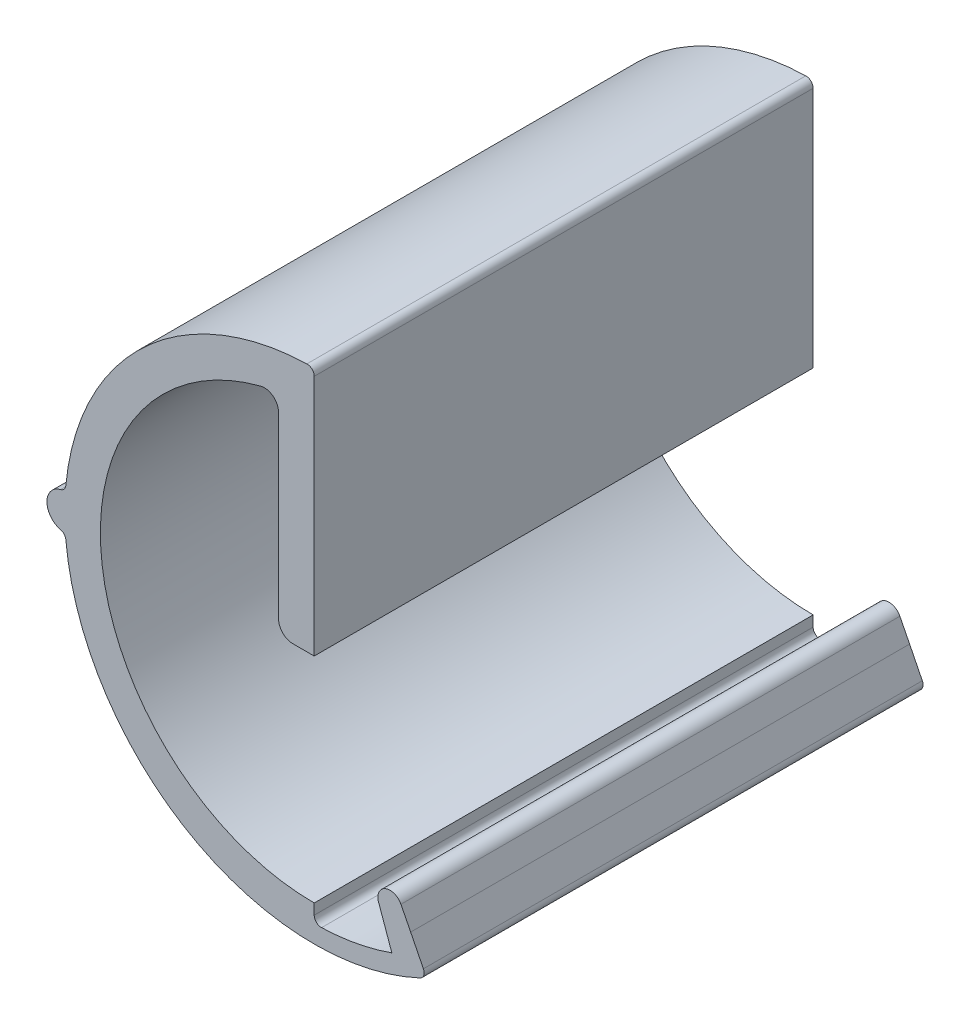
ISO-10303-21;
HEADER;
FILE_DESCRIPTION(('STEP AP214'),'2;1');
FILE_NAME('part.step','',(''),(''),'','','');
FILE_SCHEMA(('AUTOMOTIVE_DESIGN { 1 0 10303 214 1 1 1 1 }'));
ENDSEC;
DATA;
#1=APPLICATION_CONTEXT('core data for automotive mechanical design processes');
#2=APPLICATION_PROTOCOL_DEFINITION('international standard','automotive_design',2000,#1);
#3=PRODUCT_CONTEXT('',#1,'mechanical');
#4=PRODUCT('Part','Part','',(#3));
#5=PRODUCT_RELATED_PRODUCT_CATEGORY('part','',(#4));
#6=PRODUCT_DEFINITION_FORMATION('','',#4);
#7=PRODUCT_DEFINITION_CONTEXT('part definition',#1,'design');
#8=PRODUCT_DEFINITION('design','',#6,#7);
#9=PRODUCT_DEFINITION_SHAPE('','',#8);
#10=(LENGTH_UNIT() NAMED_UNIT(*) SI_UNIT(.MILLI.,.METRE.));
#11=(NAMED_UNIT(*) PLANE_ANGLE_UNIT() SI_UNIT($,.RADIAN.));
#12=(NAMED_UNIT(*) SI_UNIT($,.STERADIAN.) SOLID_ANGLE_UNIT());
#13=UNCERTAINTY_MEASURE_WITH_UNIT(LENGTH_MEASURE(1.E-05),#10,'distance_accuracy_value','');
#14=(GEOMETRIC_REPRESENTATION_CONTEXT(3) GLOBAL_UNCERTAINTY_ASSIGNED_CONTEXT((#13)) GLOBAL_UNIT_ASSIGNED_CONTEXT((#10,
#11,#12)) REPRESENTATION_CONTEXT('',''));
#15=CARTESIAN_POINT('',(0.,0.,0.));
#16=DIRECTION('',(0.,0.,1.));
#17=DIRECTION('',(1.,0.,0.));
#18=AXIS2_PLACEMENT_3D('',#15,#16,#17);
#19=CARTESIAN_POINT('',(0.,0.,-70.));
#20=DIRECTION('',(0.,-1.,0.));
#21=DIRECTION('',(1.,0.,0.));
#22=AXIS2_PLACEMENT_3D('',#19,#20,#21);
#23=PLANE('',#22);
#24=DIRECTION('',(1.,0.,0.));
#25=VECTOR('',#24,1.);
#26=CARTESIAN_POINT('',(0.,0.,0.));
#27=LINE('',#26,#25);
#28=CARTESIAN_POINT('',(-3.,0.,0.));
#29=VERTEX_POINT('',#28);
#30=CARTESIAN_POINT('',(0.,0.,0.));
#31=VERTEX_POINT('',#30);
#32=EDGE_CURVE('E262',#29,#31,#27,.T.);
#33=ORIENTED_EDGE('',*,*,#32,.F.);
#34=DIRECTION('',(0.,0.,1.));
#35=VECTOR('',#34,1.);
#36=CARTESIAN_POINT('',(-3.,0.,-70.));
#37=LINE('',#36,#35);
#38=CARTESIAN_POINT('',(-3.,0.,-70.));
#39=VERTEX_POINT('',#38);
#40=EDGE_CURVE('E198',#29,#39,#37,.F.);
#41=ORIENTED_EDGE('',*,*,#40,.T.);
#42=DIRECTION('',(1.,0.,0.));
#43=VECTOR('',#42,1.);
#44=CARTESIAN_POINT('',(0.,0.,-70.));
#45=LINE('',#44,#43);
#46=CARTESIAN_POINT('',(0.,0.,-70.));
#47=VERTEX_POINT('',#46);
#48=EDGE_CURVE('E192',#39,#47,#45,.T.);
#49=ORIENTED_EDGE('',*,*,#48,.T.);
#50=DIRECTION('',(0.,0.,1.));
#51=VECTOR('',#50,1.);
#52=CARTESIAN_POINT('',(0.,0.,-70.));
#53=LINE('',#52,#51);
#54=EDGE_CURVE('E195',#47,#31,#53,.T.);
#55=ORIENTED_EDGE('',*,*,#54,.T.);
#56=EDGE_LOOP('',(#33,#41,#49,#55));
#57=FACE_BOUND('',#56,.T.);
#58=ADVANCED_FACE('F56',(#57),#23,.T.);
#59=CARTESIAN_POINT('',(-5.,0.,-70.));
#60=DIRECTION('',(-1.,0.,0.));
#61=DIRECTION('',(0.,0.,1.));
#62=AXIS2_PLACEMENT_3D('',#59,#60,#61);
#63=PLANE('',#62);
#64=DIRECTION('',(0.,-1.,0.));
#65=VECTOR('',#64,1.);
#66=CARTESIAN_POINT('',(-5.,0.,0.));
#67=LINE('',#66,#65);
#68=CARTESIAN_POINT('',(-5.,27.1108834234519,0.));
#69=VERTEX_POINT('',#68);
#70=CARTESIAN_POINT('',(-5.,2.,0.));
#71=VERTEX_POINT('',#70);
#72=EDGE_CURVE('E205',#69,#71,#67,.T.);
#73=ORIENTED_EDGE('',*,*,#72,.F.);
#74=DIRECTION('',(0.,0.,-1.));
#75=VECTOR('',#74,1.);
#76=CARTESIAN_POINT('',(-5.,27.1108834234519,-70.));
#77=LINE('',#76,#75);
#78=CARTESIAN_POINT('',(-5.,27.1108834234519,-70.));
#79=VERTEX_POINT('',#78);
#80=EDGE_CURVE('E337',#69,#79,#77,.T.);
#81=ORIENTED_EDGE('',*,*,#80,.T.);
#82=DIRECTION('',(0.,-1.,0.));
#83=VECTOR('',#82,1.);
#84=CARTESIAN_POINT('',(-5.,0.,-70.));
#85=LINE('',#84,#83);
#86=CARTESIAN_POINT('',(-5.,2.,-70.));
#87=VERTEX_POINT('',#86);
#88=EDGE_CURVE('E215',#79,#87,#85,.T.);
#89=ORIENTED_EDGE('',*,*,#88,.T.);
#90=DIRECTION('',(0.,0.,1.));
#91=VECTOR('',#90,1.);
#92=CARTESIAN_POINT('',(-5.,2.,-70.));
#93=LINE('',#92,#91);
#94=EDGE_CURVE('E309',#87,#71,#93,.T.);
#95=ORIENTED_EDGE('',*,*,#94,.T.);
#96=EDGE_LOOP('',(#73,#81,#89,#95));
#97=FACE_BOUND('',#96,.T.);
#98=ADVANCED_FACE('F601',(#97),#63,.T.);
#99=CARTESIAN_POINT('',(0.,0.,-70.));
#100=DIRECTION('',(0.,0.,1.));
#101=DIRECTION('',(1.,0.,0.));
#102=AXIS2_PLACEMENT_3D('',#99,#100,#101);
#103=CYLINDRICAL_SURFACE('',#102,30.);
#104=CARTESIAN_POINT('',(0.,0.,-70.));
#105=DIRECTION('',(0.,0.,-1.));
#106=DIRECTION('',(1.,0.,0.));
#107=AXIS2_PLACEMENT_3D('',#104,#105,#106);
#108=CIRCLE('',#107,30.);
#109=CARTESIAN_POINT('',(0.,-30.,-70.));
#110=VERTEX_POINT('',#109);
#111=CARTESIAN_POINT('',(-7.5,29.0473750965556,-70.));
#112=VERTEX_POINT('',#111);
#113=EDGE_CURVE('E256',#110,#112,#108,.T.);
#114=ORIENTED_EDGE('',*,*,#113,.T.);
#115=DIRECTION('',(0.,0.,1.));
#116=VECTOR('',#115,1.);
#117=CARTESIAN_POINT('',(-7.5,29.0473750965556,-70.));
#118=LINE('',#117,#116);
#119=CARTESIAN_POINT('',(-7.5,29.0473750965556,0.));
#120=VERTEX_POINT('',#119);
#121=EDGE_CURVE('E333',#112,#120,#118,.T.);
#122=ORIENTED_EDGE('',*,*,#121,.T.);
#123=CARTESIAN_POINT('',(0.,0.,0.));
#124=DIRECTION('',(0.,0.,-1.));
#125=DIRECTION('',(1.,0.,0.));
#126=AXIS2_PLACEMENT_3D('',#123,#124,#125);
#127=CIRCLE('',#126,30.);
#128=CARTESIAN_POINT('',(0.,-30.,0.));
#129=VERTEX_POINT('',#128);
#130=EDGE_CURVE('E299',#129,#120,#127,.T.);
#131=ORIENTED_EDGE('',*,*,#130,.F.);
#132=DIRECTION('',(0.,0.,1.));
#133=VECTOR('',#132,1.);
#134=CARTESIAN_POINT('',(0.,-30.,-70.));
#135=LINE('',#134,#133);
#136=EDGE_CURVE('E305',#110,#129,#135,.T.);
#137=ORIENTED_EDGE('',*,*,#136,.F.);
#138=EDGE_LOOP('',(#114,#122,#131,#137));
#139=FACE_BOUND('',#138,.T.);
#140=ADVANCED_FACE('F539',(#139),#103,.F.);
#141=CARTESIAN_POINT('',(0.,-30.,-70.));
#142=DIRECTION('',(1.,0.,0.));
#143=DIRECTION('',(0.,0.,-1.));
#144=AXIS2_PLACEMENT_3D('',#141,#142,#143);
#145=PLANE('',#144);
#146=DIRECTION('',(0.,1.,0.));
#147=VECTOR('',#146,1.);
#148=CARTESIAN_POINT('',(0.,-30.,0.));
#149=LINE('',#148,#147);
#150=CARTESIAN_POINT('',(0.,-31.4841229828623,0.));
#151=VERTEX_POINT('',#150);
#152=EDGE_CURVE('E296',#151,#129,#149,.T.);
#153=ORIENTED_EDGE('',*,*,#152,.F.);
#154=DIRECTION('',(0.,0.,-1.));
#155=VECTOR('',#154,1.);
#156=CARTESIAN_POINT('',(0.,-31.4841229828623,-70.));
#157=LINE('',#156,#155);
#158=CARTESIAN_POINT('',(0.,-31.4841229828623,-70.));
#159=VERTEX_POINT('',#158);
#160=EDGE_CURVE('E350',#151,#159,#157,.T.);
#161=ORIENTED_EDGE('',*,*,#160,.T.);
#162=DIRECTION('',(0.,1.,0.));
#163=VECTOR('',#162,1.);
#164=CARTESIAN_POINT('',(0.,-30.,-70.));
#165=LINE('',#164,#163);
#166=EDGE_CURVE('E253',#159,#110,#165,.T.);
#167=ORIENTED_EDGE('',*,*,#166,.T.);
#168=ORIENTED_EDGE('',*,*,#136,.T.);
#169=EDGE_LOOP('',(#153,#161,#167,#168));
#170=FACE_BOUND('',#169,.T.);
#171=ADVANCED_FACE('F545',(#170),#145,.T.);
#172=CARTESIAN_POINT('',(0.,0.,-70.));
#173=DIRECTION('',(0.,0.,1.));
#174=DIRECTION('',(1.,0.,0.));
#175=AXIS2_PLACEMENT_3D('',#172,#173,#174);
#176=CYLINDRICAL_SURFACE('',#175,32.5);
#177=CARTESIAN_POINT('',(0.,0.,-70.));
#178=DIRECTION('',(0.,0.,-1.));
#179=DIRECTION('',(1.,0.,0.));
#180=AXIS2_PLACEMENT_3D('',#177,#178,#179);
#181=CIRCLE('',#180,32.5);
#182=CARTESIAN_POINT('',(10.8933890075338,-30.6199947082057,-70.));
#183=VERTEX_POINT('',#182);
#184=CARTESIAN_POINT('',(1.03174603174603,-32.4836189505722,-70.));
#185=VERTEX_POINT('',#184);
#186=EDGE_CURVE('E249',#183,#185,#181,.T.);
#187=ORIENTED_EDGE('',*,*,#186,.T.);
#188=DIRECTION('',(0.,0.,1.));
#189=VECTOR('',#188,1.);
#190=CARTESIAN_POINT('',(1.03174603174603,-32.4836189505723,-70.));
#191=LINE('',#190,#189);
#192=CARTESIAN_POINT('',(1.03174603174603,-32.4836189505722,0.));
#193=VERTEX_POINT('',#192);
#194=EDGE_CURVE('E346',#185,#193,#191,.T.);
#195=ORIENTED_EDGE('',*,*,#194,.T.);
#196=CARTESIAN_POINT('',(0.,0.,0.));
#197=DIRECTION('',(0.,0.,-1.));
#198=DIRECTION('',(1.,0.,0.));
#199=AXIS2_PLACEMENT_3D('',#196,#197,#198);
#200=CIRCLE('',#199,32.5);
#201=CARTESIAN_POINT('',(10.8933890075338,-30.6199947082057,0.));
#202=VERTEX_POINT('',#201);
#203=EDGE_CURVE('E292',#202,#193,#200,.T.);
#204=ORIENTED_EDGE('',*,*,#203,.F.);
#205=DIRECTION('',(0.,0.,1.));
#206=VECTOR('',#205,1.);
#207=CARTESIAN_POINT('',(10.8933890075338,-30.6199947082057,-70.));
#208=LINE('',#207,#206);
#209=EDGE_CURVE('E310',#183,#202,#208,.T.);
#210=ORIENTED_EDGE('',*,*,#209,.F.);
#211=EDGE_LOOP('',(#187,#195,#204,#210));
#212=FACE_BOUND('',#211,.T.);
#213=ADVANCED_FACE('F554',(#212),#176,.F.);
#214=CARTESIAN_POINT('',(10.8933890075338,-30.6199947082057,-70.));
#215=DIRECTION('',(-0.942153683329405,-0.335181200231809,0.));
#216=DIRECTION('',(0.335181200231809,-0.942153683329405,0.));
#217=AXIS2_PLACEMENT_3D('',#214,#215,#216);
#218=PLANE('',#217);
#219=DIRECTION('',(0.335181200231809,-0.942153683329405,0.));
#220=VECTOR('',#219,1.);
#221=CARTESIAN_POINT('',(10.8933890075338,-30.6199947082057,0.));
#222=LINE('',#221,#220);
#223=CARTESIAN_POINT('',(9.11458579229113,-25.6199947082057,0.));
#224=VERTEX_POINT('',#223);
#225=EDGE_CURVE('E288',#224,#202,#222,.T.);
#226=ORIENTED_EDGE('',*,*,#225,.F.);
#227=DIRECTION('',(0.,0.,1.));
#228=VECTOR('',#227,1.);
#229=CARTESIAN_POINT('',(9.11458579229113,-25.6199947082057,-70.));
#230=LINE('',#229,#228);
#231=CARTESIAN_POINT('',(9.11458579229113,-25.6199947082057,-70.));
#232=VERTEX_POINT('',#231);
#233=EDGE_CURVE('E313',#232,#224,#230,.T.);
#234=ORIENTED_EDGE('',*,*,#233,.F.);
#235=DIRECTION('',(0.335181200231809,-0.942153683329405,0.));
#236=VECTOR('',#235,1.);
#237=CARTESIAN_POINT('',(10.8933890075338,-30.6199947082057,-70.));
#238=LINE('',#237,#236);
#239=EDGE_CURVE('E245',#232,#183,#238,.T.);
#240=ORIENTED_EDGE('',*,*,#239,.T.);
#241=ORIENTED_EDGE('',*,*,#209,.T.);
#242=EDGE_LOOP('',(#226,#234,#240,#241));
#243=FACE_BOUND('',#242,.T.);
#244=ADVANCED_FACE('F558',(#243),#218,.T.);
#245=CARTESIAN_POINT('',(10.642255793479,-24.8477744553808,-70.));
#246=DIRECTION('',(0.,0.,1.));
#247=DIRECTION('',(1.,0.,0.));
#248=AXIS2_PLACEMENT_3D('',#245,#246,#247);
#249=CYLINDRICAL_SURFACE('',#248,1.71175341431008);
#250=CARTESIAN_POINT('',(10.642255793479,-24.8477744553808,0.));
#251=DIRECTION('',(0.,0.,1.));
#252=DIRECTION('',(1.,0.,0.));
#253=AXIS2_PLACEMENT_3D('',#250,#251,#252);
#254=CIRCLE('',#253,1.71175341431008);
#255=CARTESIAN_POINT('',(12.1699257946669,-24.075554202556,0.));
#256=VERTEX_POINT('',#255);
#257=EDGE_CURVE('E284',#256,#224,#254,.T.);
#258=ORIENTED_EDGE('',*,*,#257,.F.);
#259=DIRECTION('',(0.,0.,1.));
#260=VECTOR('',#259,1.);
#261=CARTESIAN_POINT('',(12.1699257946669,-24.075554202556,-70.));
#262=LINE('',#261,#260);
#263=CARTESIAN_POINT('',(12.1699257946669,-24.075554202556,-70.));
#264=VERTEX_POINT('',#263);
#265=EDGE_CURVE('E316',#264,#256,#262,.T.);
#266=ORIENTED_EDGE('',*,*,#265,.F.);
#267=CARTESIAN_POINT('',(10.642255793479,-24.8477744553808,-70.));
#268=DIRECTION('',(0.,0.,1.));
#269=DIRECTION('',(1.,0.,0.));
#270=AXIS2_PLACEMENT_3D('',#267,#268,#269);
#271=CIRCLE('',#270,1.71175341431008);
#272=EDGE_CURVE('E241',#264,#232,#271,.T.);
#273=ORIENTED_EDGE('',*,*,#272,.T.);
#274=ORIENTED_EDGE('',*,*,#233,.T.);
#275=EDGE_LOOP('',(#258,#266,#273,#274));
#276=FACE_BOUND('',#275,.T.);
#277=ADVANCED_FACE('F563',(#276),#249,.T.);
#278=CARTESIAN_POINT('',(13.5338462836259,-26.7737745708592,-70.));
#279=DIRECTION('',(0.892459152361973,0.451128209454196,0.));
#280=DIRECTION('',(-0.451128209454196,0.892459152361973,0.));
#281=AXIS2_PLACEMENT_3D('',#278,#279,#280);
#282=PLANE('',#281);
#283=DIRECTION('',(-0.451128209454196,0.892459152361973,0.));
#284=VECTOR('',#283,1.);
#285=CARTESIAN_POINT('',(13.5338462836259,-26.7737745708592,0.));
#286=LINE('',#285,#284);
#287=CARTESIAN_POINT('',(13.5338462836259,-26.7737745708592,0.));
#288=VERTEX_POINT('',#287);
#289=EDGE_CURVE('E280',#288,#256,#286,.T.);
#290=ORIENTED_EDGE('',*,*,#289,.F.);
#291=DIRECTION('',(0.,0.,1.));
#292=VECTOR('',#291,1.);
#293=CARTESIAN_POINT('',(13.5338462836259,-26.7737745708592,-70.));
#294=LINE('',#293,#292);
#295=CARTESIAN_POINT('',(13.5338462836259,-26.7737745708592,-70.));
#296=VERTEX_POINT('',#295);
#297=EDGE_CURVE('E214',#296,#288,#294,.T.);
#298=ORIENTED_EDGE('',*,*,#297,.F.);
#299=DIRECTION('',(-0.451128209454196,0.892459152361973,0.));
#300=VECTOR('',#299,1.);
#301=CARTESIAN_POINT('',(13.5338462836259,-26.7737745708592,-70.));
#302=LINE('',#301,#300);
#303=EDGE_CURVE('E237',#296,#264,#302,.T.);
#304=ORIENTED_EDGE('',*,*,#303,.T.);
#305=ORIENTED_EDGE('',*,*,#265,.T.);
#306=EDGE_LOOP('',(#290,#298,#304,#305));
#307=FACE_BOUND('',#306,.T.);
#308=ADVANCED_FACE('F566',(#307),#282,.T.);
#309=CARTESIAN_POINT('',(13.5338462836259,-26.7737745708592,-70.));
#310=DIRECTION('',(0.894282699849301,0.447502461166691,0.));
#311=DIRECTION('',(-0.447502461166691,0.894282699849301,0.));
#312=AXIS2_PLACEMENT_3D('',#309,#310,#311);
#313=PLANE('',#312);
#314=DIRECTION('',(-0.447502461166691,0.8942826998493,0.));
#315=VECTOR('',#314,1.);
#316=CARTESIAN_POINT('',(13.5338462836259,-26.7737745708592,0.));
#317=LINE('',#316,#315);
#318=CARTESIAN_POINT('',(15.318889884704,-30.3409808980804,0.));
#319=VERTEX_POINT('',#318);
#320=EDGE_CURVE('E277',#319,#288,#317,.T.);
#321=ORIENTED_EDGE('',*,*,#320,.F.);
#322=DIRECTION('',(0.,0.,1.));
#323=VECTOR('',#322,1.);
#324=CARTESIAN_POINT('',(15.318889884704,-30.3409808980804,-70.));
#325=LINE('',#324,#323);
#326=CARTESIAN_POINT('',(15.318889884704,-30.3409808980804,-70.));
#327=VERTEX_POINT('',#326);
#328=EDGE_CURVE('E366',#319,#327,#325,.F.);
#329=ORIENTED_EDGE('',*,*,#328,.T.);
#330=DIRECTION('',(-0.447502461166691,0.8942826998493,0.));
#331=VECTOR('',#330,1.);
#332=CARTESIAN_POINT('',(13.5338462836259,-26.7737745708592,-70.));
#333=LINE('',#332,#331);
#334=EDGE_CURVE('E234',#327,#296,#333,.T.);
#335=ORIENTED_EDGE('',*,*,#334,.T.);
#336=ORIENTED_EDGE('',*,*,#297,.T.);
#337=EDGE_LOOP('',(#321,#329,#335,#336));
#338=FACE_BOUND('',#337,.T.);
#339=ADVANCED_FACE('F717',(#338),#313,.T.);
#340=CARTESIAN_POINT('',(0.,0.,-70.));
#341=DIRECTION('',(0.,0.,1.));
#342=DIRECTION('',(1.,0.,0.));
#343=AXIS2_PLACEMENT_3D('',#340,#341,#342);
#344=CYLINDRICAL_SURFACE('',#343,35.);
#345=CARTESIAN_POINT('',(0.,0.,0.));
#346=DIRECTION('',(0.,0.,1.));
#347=DIRECTION('',(1.,0.,0.));
#348=AXIS2_PLACEMENT_3D('',#345,#346,#347);
#349=CIRCLE('',#348,35.);
#350=CARTESIAN_POINT('',(-34.84375,-3.30349601747917,0.));
#351=VERTEX_POINT('',#350);
#352=CARTESIAN_POINT('',(14.8488603373505,-31.6940269874603,0.));
#353=VERTEX_POINT('',#352);
#354=EDGE_CURVE('E274',#351,#353,#349,.T.);
#355=ORIENTED_EDGE('',*,*,#354,.F.);
#356=DIRECTION('',(0.,0.,1.));
#357=VECTOR('',#356,1.);
#358=CARTESIAN_POINT('',(-34.84375,-3.30349601747917,-70.));
#359=LINE('',#358,#357);
#360=CARTESIAN_POINT('',(-34.84375,-3.30349601747917,-70.));
#361=VERTEX_POINT('',#360);
#362=EDGE_CURVE('E380',#351,#361,#359,.F.);
#363=ORIENTED_EDGE('',*,*,#362,.T.);
#364=CARTESIAN_POINT('',(0.,0.,-70.));
#365=DIRECTION('',(0.,0.,1.));
#366=DIRECTION('',(1.,0.,0.));
#367=AXIS2_PLACEMENT_3D('',#364,#365,#366);
#368=CIRCLE('',#367,35.);
#369=CARTESIAN_POINT('',(14.8488603373505,-31.6940269874603,-70.));
#370=VERTEX_POINT('',#369);
#371=EDGE_CURVE('E231',#361,#370,#368,.T.);
#372=ORIENTED_EDGE('',*,*,#371,.T.);
#373=DIRECTION('',(0.,0.,1.));
#374=VECTOR('',#373,1.);
#375=CARTESIAN_POINT('',(14.8488603373505,-31.6940269874603,-70.));
#376=LINE('',#375,#374);
#377=EDGE_CURVE('E359',#370,#353,#376,.T.);
#378=ORIENTED_EDGE('',*,*,#377,.T.);
#379=EDGE_LOOP('',(#355,#363,#372,#378));
#380=FACE_BOUND('',#379,.T.);
#381=ADVANCED_FACE('F579',(#380),#344,.T.);
#382=CARTESIAN_POINT('',(-35.,-2.44403693719019E-13,-70.));
#383=DIRECTION('',(0.,0.,1.));
#384=DIRECTION('',(1.,0.,0.));
#385=AXIS2_PLACEMENT_3D('',#382,#383,#384);
#386=CYLINDRICAL_SURFACE('',#385,2.49999999999987);
#387=CARTESIAN_POINT('',(-35.,-2.44403693719019E-13,-70.));
#388=DIRECTION('',(0.,0.,1.));
#389=DIRECTION('',(1.,0.,0.));
#390=AXIS2_PLACEMENT_3D('',#387,#388,#389);
#391=CIRCLE('',#390,2.49999999999987);
#392=CARTESIAN_POINT('',(-35.5994897959184,2.42705829855566,-70.));
#393=VERTEX_POINT('',#392);
#394=CARTESIAN_POINT('',(-35.5994897959184,-2.42705829855616,-70.));
#395=VERTEX_POINT('',#394);
#396=EDGE_CURVE('E225',#393,#395,#391,.T.);
#397=ORIENTED_EDGE('',*,*,#396,.T.);
#398=DIRECTION('',(0.,0.,1.));
#399=VECTOR('',#398,1.);
#400=CARTESIAN_POINT('',(-35.5994897959184,-2.42705829855616,-70.));
#401=LINE('',#400,#399);
#402=CARTESIAN_POINT('',(-35.5994897959184,-2.42705829855616,0.));
#403=VERTEX_POINT('',#402);
#404=EDGE_CURVE('E376',#395,#403,#401,.T.);
#405=ORIENTED_EDGE('',*,*,#404,.T.);
#406=CARTESIAN_POINT('',(-35.,-2.44403693719019E-13,0.));
#407=DIRECTION('',(0.,0.,1.));
#408=DIRECTION('',(1.,0.,0.));
#409=AXIS2_PLACEMENT_3D('',#406,#407,#408);
#410=CIRCLE('',#409,2.49999999999987);
#411=CARTESIAN_POINT('',(-35.5994897959184,2.42705829855566,0.));
#412=VERTEX_POINT('',#411);
#413=EDGE_CURVE('E270',#412,#403,#410,.T.);
#414=ORIENTED_EDGE('',*,*,#413,.F.);
#415=DIRECTION('',(0.,0.,1.));
#416=VECTOR('',#415,1.);
#417=CARTESIAN_POINT('',(-35.5994897959184,2.42705829855566,-70.));
#418=LINE('',#417,#416);
#419=EDGE_CURVE('E373',#412,#393,#418,.F.);
#420=ORIENTED_EDGE('',*,*,#419,.T.);
#421=EDGE_LOOP('',(#397,#405,#414,#420));
#422=FACE_BOUND('',#421,.T.);
#423=ADVANCED_FACE('F588',(#422),#386,.T.);
#424=CARTESIAN_POINT('',(0.,0.,-70.));
#425=DIRECTION('',(0.,0.,1.));
#426=DIRECTION('',(1.,0.,0.));
#427=AXIS2_PLACEMENT_3D('',#424,#425,#426);
#428=CYLINDRICAL_SURFACE('',#427,35.);
#429=CARTESIAN_POINT('',(0.,0.,0.));
#430=DIRECTION('',(0.,0.,1.));
#431=DIRECTION('',(1.,0.,0.));
#432=AXIS2_PLACEMENT_3D('',#429,#430,#431);
#433=CIRCLE('',#432,35.);
#434=CARTESIAN_POINT('',(-1.02941176470588,34.9848583164015,0.));
#435=VERTEX_POINT('',#434);
#436=CARTESIAN_POINT('',(-34.84375,3.30349601747865,0.));
#437=VERTEX_POINT('',#436);
#438=EDGE_CURVE('E267',#435,#437,#433,.T.);
#439=ORIENTED_EDGE('',*,*,#438,.F.);
#440=DIRECTION('',(0.,0.,1.));
#441=VECTOR('',#440,1.);
#442=CARTESIAN_POINT('',(-1.02941176470588,34.9848583164015,-70.));
#443=LINE('',#442,#441);
#444=CARTESIAN_POINT('',(-1.02941176470588,34.9848583164015,-70.));
#445=VERTEX_POINT('',#444);
#446=EDGE_CURVE('E65',#435,#445,#443,.F.);
#447=ORIENTED_EDGE('',*,*,#446,.T.);
#448=CARTESIAN_POINT('',(0.,0.,-70.));
#449=DIRECTION('',(0.,0.,1.));
#450=DIRECTION('',(1.,0.,0.));
#451=AXIS2_PLACEMENT_3D('',#448,#449,#450);
#452=CIRCLE('',#451,35.);
#453=CARTESIAN_POINT('',(-34.84375,3.30349601747865,-70.));
#454=VERTEX_POINT('',#453);
#455=EDGE_CURVE('E220',#445,#454,#452,.T.);
#456=ORIENTED_EDGE('',*,*,#455,.T.);
#457=DIRECTION('',(0.,0.,1.));
#458=VECTOR('',#457,1.);
#459=CARTESIAN_POINT('',(-34.84375,3.30349601747865,-70.));
#460=LINE('',#459,#458);
#461=EDGE_CURVE('E383',#454,#437,#460,.T.);
#462=ORIENTED_EDGE('',*,*,#461,.T.);
#463=EDGE_LOOP('',(#439,#447,#456,#462));
#464=FACE_BOUND('',#463,.T.);
#465=ADVANCED_FACE('F595',(#464),#428,.T.);
#466=CARTESIAN_POINT('',(0.,35.,-70.));
#467=DIRECTION('',(1.,0.,0.));
#468=DIRECTION('',(0.,0.,-1.));
#469=AXIS2_PLACEMENT_3D('',#466,#467,#468);
#470=PLANE('',#469);
#471=DIRECTION('',(0.,1.,0.));
#472=VECTOR('',#471,1.);
#473=CARTESIAN_POINT('',(0.,35.,-70.));
#474=LINE('',#473,#472);
#475=CARTESIAN_POINT('',(0.,33.9852909359329,-70.));
#476=VERTEX_POINT('',#475);
#477=EDGE_CURVE('E204',#47,#476,#474,.T.);
#478=ORIENTED_EDGE('',*,*,#477,.T.);
#479=DIRECTION('',(0.,0.,1.));
#480=VECTOR('',#479,1.);
#481=CARTESIAN_POINT('',(0.,33.9852909359329,-70.));
#482=LINE('',#481,#480);
#483=CARTESIAN_POINT('',(0.,33.9852909359329,0.));
#484=VERTEX_POINT('',#483);
#485=EDGE_CURVE('E400',#476,#484,#482,.T.);
#486=ORIENTED_EDGE('',*,*,#485,.T.);
#487=DIRECTION('',(0.,1.,0.));
#488=VECTOR('',#487,1.);
#489=CARTESIAN_POINT('',(0.,35.,0.));
#490=LINE('',#489,#488);
#491=EDGE_CURVE('E212',#31,#484,#490,.T.);
#492=ORIENTED_EDGE('',*,*,#491,.F.);
#493=ORIENTED_EDGE('',*,*,#54,.F.);
#494=EDGE_LOOP('',(#478,#486,#492,#493));
#495=FACE_BOUND('',#494,.T.);
#496=ADVANCED_FACE('F209',(#495),#470,.T.);
#497=CARTESIAN_POINT('',(0.,0.,-70.));
#498=DIRECTION('',(0.,0.,1.));
#499=DIRECTION('',(1.,0.,0.));
#500=AXIS2_PLACEMENT_3D('',#497,#498,#499);
#501=PLANE('',#500);
#502=ORIENTED_EDGE('',*,*,#455,.F.);
#503=CARTESIAN_POINT('',(-1.,33.9852909359329,-70.));
#504=DIRECTION('',(0.,0.,1.));
#505=DIRECTION('',(1.,0.,0.));
#506=AXIS2_PLACEMENT_3D('',#503,#504,#505);
#507=CIRCLE('',#506,1.);
#508=EDGE_CURVE('E13',#445,#476,#507,.F.);
#509=ORIENTED_EDGE('',*,*,#508,.T.);
#510=ORIENTED_EDGE('',*,*,#477,.F.);
#511=ORIENTED_EDGE('',*,*,#48,.F.);
#512=CARTESIAN_POINT('',(-3.,2.,-70.));
#513=DIRECTION('',(0.,0.,1.));
#514=DIRECTION('',(1.,0.,0.));
#515=AXIS2_PLACEMENT_3D('',#512,#513,#514);
#516=CIRCLE('',#515,2.);
#517=EDGE_CURVE('E330',#39,#87,#516,.F.);
#518=ORIENTED_EDGE('',*,*,#517,.T.);
#519=ORIENTED_EDGE('',*,*,#88,.F.);
#520=CARTESIAN_POINT('',(-7.,27.1108834234519,-70.));
#521=DIRECTION('',(0.,0.,1.));
#522=DIRECTION('',(1.,0.,0.));
#523=AXIS2_PLACEMENT_3D('',#520,#521,#522);
#524=CIRCLE('',#523,2.);
#525=EDGE_CURVE('E343',#79,#112,#524,.T.);
#526=ORIENTED_EDGE('',*,*,#525,.T.);
#527=ORIENTED_EDGE('',*,*,#113,.F.);
#528=ORIENTED_EDGE('',*,*,#166,.F.);
#529=CARTESIAN_POINT('',(1.,-31.4841229828623,-70.));
#530=DIRECTION('',(0.,0.,1.));
#531=DIRECTION('',(1.,0.,0.));
#532=AXIS2_PLACEMENT_3D('',#529,#530,#531);
#533=CIRCLE('',#532,1.);
#534=EDGE_CURVE('E356',#159,#185,#533,.T.);
#535=ORIENTED_EDGE('',*,*,#534,.T.);
#536=ORIENTED_EDGE('',*,*,#186,.F.);
#537=ORIENTED_EDGE('',*,*,#239,.F.);
#538=ORIENTED_EDGE('',*,*,#272,.F.);
#539=ORIENTED_EDGE('',*,*,#303,.F.);
#540=ORIENTED_EDGE('',*,*,#334,.F.);
#541=CARTESIAN_POINT('',(14.4246071848547,-30.7884833592471,-70.));
#542=DIRECTION('',(0.,0.,1.));
#543=DIRECTION('',(1.,0.,0.));
#544=AXIS2_PLACEMENT_3D('',#541,#542,#543);
#545=CIRCLE('',#544,1.);
#546=EDGE_CURVE('E369',#327,#370,#545,.F.);
#547=ORIENTED_EDGE('',*,*,#546,.T.);
#548=ORIENTED_EDGE('',*,*,#371,.F.);
#549=CARTESIAN_POINT('',(-35.8392857142857,-3.39788161797858,-70.));
#550=DIRECTION('',(0.,0.,1.));
#551=DIRECTION('',(1.,0.,0.));
#552=AXIS2_PLACEMENT_3D('',#549,#550,#551);
#553=CIRCLE('',#552,1.);
#554=EDGE_CURVE('E390',#361,#395,#553,.T.);
#555=ORIENTED_EDGE('',*,*,#554,.T.);
#556=ORIENTED_EDGE('',*,*,#396,.F.);
#557=CARTESIAN_POINT('',(-35.8392857142858,3.39788161797804,-70.));
#558=DIRECTION('',(0.,0.,1.));
#559=DIRECTION('',(1.,0.,0.));
#560=AXIS2_PLACEMENT_3D('',#557,#558,#559);
#561=CIRCLE('',#560,1.);
#562=EDGE_CURVE('E396',#393,#454,#561,.T.);
#563=ORIENTED_EDGE('',*,*,#562,.T.);
#564=EDGE_LOOP('',(#502,#509,#510,#511,#518,#519,#526,#527,#528,#535,#536,#537,#538,#539,#540,
#547,#548,#555,#556,#563));
#565=FACE_BOUND('',#564,.T.);
#566=ADVANCED_FACE('F217',(#565),#501,.F.);
#567=CARTESIAN_POINT('',(0.,0.,0.));
#568=DIRECTION('',(0.,0.,1.));
#569=DIRECTION('',(1.,0.,0.));
#570=AXIS2_PLACEMENT_3D('',#567,#568,#569);
#571=PLANE('',#570);
#572=ORIENTED_EDGE('',*,*,#491,.T.);
#573=CARTESIAN_POINT('',(-1.,33.9852909359329,0.));
#574=DIRECTION('',(0.,0.,1.));
#575=DIRECTION('',(1.,0.,0.));
#576=AXIS2_PLACEMENT_3D('',#573,#574,#575);
#577=CIRCLE('',#576,1.);
#578=EDGE_CURVE('E79',#484,#435,#577,.T.);
#579=ORIENTED_EDGE('',*,*,#578,.T.);
#580=ORIENTED_EDGE('',*,*,#438,.T.);
#581=CARTESIAN_POINT('',(-35.8392857142858,3.39788161797804,0.));
#582=DIRECTION('',(0.,0.,1.));
#583=DIRECTION('',(1.,0.,0.));
#584=AXIS2_PLACEMENT_3D('',#581,#582,#583);
#585=CIRCLE('',#584,1.);
#586=EDGE_CURVE('E393',#437,#412,#585,.F.);
#587=ORIENTED_EDGE('',*,*,#586,.T.);
#588=ORIENTED_EDGE('',*,*,#413,.T.);
#589=CARTESIAN_POINT('',(-35.8392857142857,-3.39788161797858,0.));
#590=DIRECTION('',(0.,0.,1.));
#591=DIRECTION('',(1.,0.,0.));
#592=AXIS2_PLACEMENT_3D('',#589,#590,#591);
#593=CIRCLE('',#592,1.);
#594=EDGE_CURVE('E387',#403,#351,#593,.F.);
#595=ORIENTED_EDGE('',*,*,#594,.T.);
#596=ORIENTED_EDGE('',*,*,#354,.T.);
#597=CARTESIAN_POINT('',(14.4246071848547,-30.7884833592471,0.));
#598=DIRECTION('',(0.,0.,1.));
#599=DIRECTION('',(1.,0.,0.));
#600=AXIS2_PLACEMENT_3D('',#597,#598,#599);
#601=CIRCLE('',#600,1.);
#602=EDGE_CURVE('E363',#353,#319,#601,.T.);
#603=ORIENTED_EDGE('',*,*,#602,.T.);
#604=ORIENTED_EDGE('',*,*,#320,.T.);
#605=ORIENTED_EDGE('',*,*,#289,.T.);
#606=ORIENTED_EDGE('',*,*,#257,.T.);
#607=ORIENTED_EDGE('',*,*,#225,.T.);
#608=ORIENTED_EDGE('',*,*,#203,.T.);
#609=CARTESIAN_POINT('',(1.,-31.4841229828623,0.));
#610=DIRECTION('',(0.,0.,1.));
#611=DIRECTION('',(1.,0.,0.));
#612=AXIS2_PLACEMENT_3D('',#609,#610,#611);
#613=CIRCLE('',#612,1.);
#614=EDGE_CURVE('E353',#193,#151,#613,.F.);
#615=ORIENTED_EDGE('',*,*,#614,.T.);
#616=ORIENTED_EDGE('',*,*,#152,.T.);
#617=ORIENTED_EDGE('',*,*,#130,.T.);
#618=CARTESIAN_POINT('',(-7.,27.1108834234519,0.));
#619=DIRECTION('',(0.,0.,1.));
#620=DIRECTION('',(1.,0.,0.));
#621=AXIS2_PLACEMENT_3D('',#618,#619,#620);
#622=CIRCLE('',#621,2.);
#623=EDGE_CURVE('E340',#120,#69,#622,.F.);
#624=ORIENTED_EDGE('',*,*,#623,.T.);
#625=ORIENTED_EDGE('',*,*,#72,.T.);
#626=CARTESIAN_POINT('',(-3.,2.,0.));
#627=DIRECTION('',(0.,0.,1.));
#628=DIRECTION('',(1.,0.,0.));
#629=AXIS2_PLACEMENT_3D('',#626,#627,#628);
#630=CIRCLE('',#629,2.);
#631=EDGE_CURVE('E325',#71,#29,#630,.T.);
#632=ORIENTED_EDGE('',*,*,#631,.T.);
#633=ORIENTED_EDGE('',*,*,#32,.T.);
#634=EDGE_LOOP('',(#572,#579,#580,#587,#588,#595,#596,#603,#604,#605,#606,#607,#608,#615,#616,
#617,#624,#625,#632,#633));
#635=FACE_BOUND('',#634,.T.);
#636=ADVANCED_FACE('F524',(#635),#571,.T.);
#637=CARTESIAN_POINT('',(-3.,2.,-70.));
#638=DIRECTION('',(0.,0.,1.));
#639=DIRECTION('',(1.,0.,0.));
#640=AXIS2_PLACEMENT_3D('',#637,#638,#639);
#641=CYLINDRICAL_SURFACE('',#640,2.);
#642=ORIENTED_EDGE('',*,*,#517,.F.);
#643=ORIENTED_EDGE('',*,*,#40,.F.);
#644=ORIENTED_EDGE('',*,*,#631,.F.);
#645=ORIENTED_EDGE('',*,*,#94,.F.);
#646=EDGE_LOOP('',(#642,#643,#644,#645));
#647=FACE_BOUND('',#646,.T.);
#648=ADVANCED_FACE('F527',(#647),#641,.T.);
#649=CARTESIAN_POINT('',(-7.,27.1108834234519,-70.));
#650=DIRECTION('',(0.,0.,1.));
#651=DIRECTION('',(1.,0.,0.));
#652=AXIS2_PLACEMENT_3D('',#649,#650,#651);
#653=CYLINDRICAL_SURFACE('',#652,2.);
#654=ORIENTED_EDGE('',*,*,#525,.F.);
#655=ORIENTED_EDGE('',*,*,#80,.F.);
#656=ORIENTED_EDGE('',*,*,#623,.F.);
#657=ORIENTED_EDGE('',*,*,#121,.F.);
#658=EDGE_LOOP('',(#654,#655,#656,#657));
#659=FACE_BOUND('',#658,.T.);
#660=ADVANCED_FACE('F536',(#659),#653,.F.);
#661=CARTESIAN_POINT('',(1.,-31.4841229828623,-70.));
#662=DIRECTION('',(0.,0.,1.));
#663=DIRECTION('',(1.,0.,0.));
#664=AXIS2_PLACEMENT_3D('',#661,#662,#663);
#665=CYLINDRICAL_SURFACE('',#664,1.);
#666=ORIENTED_EDGE('',*,*,#534,.F.);
#667=ORIENTED_EDGE('',*,*,#160,.F.);
#668=ORIENTED_EDGE('',*,*,#614,.F.);
#669=ORIENTED_EDGE('',*,*,#194,.F.);
#670=EDGE_LOOP('',(#666,#667,#668,#669));
#671=FACE_BOUND('',#670,.T.);
#672=ADVANCED_FACE('F551',(#671),#665,.F.);
#673=CARTESIAN_POINT('',(14.4246071848547,-30.7884833592471,-70.));
#674=DIRECTION('',(0.,0.,1.));
#675=DIRECTION('',(1.,0.,0.));
#676=AXIS2_PLACEMENT_3D('',#673,#674,#675);
#677=CYLINDRICAL_SURFACE('',#676,1.);
#678=ORIENTED_EDGE('',*,*,#546,.F.);
#679=ORIENTED_EDGE('',*,*,#328,.F.);
#680=ORIENTED_EDGE('',*,*,#602,.F.);
#681=ORIENTED_EDGE('',*,*,#377,.F.);
#682=EDGE_LOOP('',(#678,#679,#680,#681));
#683=FACE_BOUND('',#682,.T.);
#684=ADVANCED_FACE('F575',(#683),#677,.T.);
#685=CARTESIAN_POINT('',(-35.8392857142857,-3.39788161797858,-70.));
#686=DIRECTION('',(0.,0.,-1.));
#687=DIRECTION('',(-1.,0.,0.));
#688=AXIS2_PLACEMENT_3D('',#685,#686,#687);
#689=CYLINDRICAL_SURFACE('',#688,1.);
#690=ORIENTED_EDGE('',*,*,#554,.F.);
#691=ORIENTED_EDGE('',*,*,#362,.F.);
#692=ORIENTED_EDGE('',*,*,#594,.F.);
#693=ORIENTED_EDGE('',*,*,#404,.F.);
#694=EDGE_LOOP('',(#690,#691,#692,#693));
#695=FACE_BOUND('',#694,.T.);
#696=ADVANCED_FACE('F585',(#695),#689,.F.);
#697=CARTESIAN_POINT('',(-35.8392857142858,3.39788161797804,-70.));
#698=DIRECTION('',(0.,0.,-1.));
#699=DIRECTION('',(-1.,0.,0.));
#700=AXIS2_PLACEMENT_3D('',#697,#698,#699);
#701=CYLINDRICAL_SURFACE('',#700,1.);
#702=ORIENTED_EDGE('',*,*,#562,.F.);
#703=ORIENTED_EDGE('',*,*,#419,.F.);
#704=ORIENTED_EDGE('',*,*,#586,.F.);
#705=ORIENTED_EDGE('',*,*,#461,.F.);
#706=EDGE_LOOP('',(#702,#703,#704,#705));
#707=FACE_BOUND('',#706,.T.);
#708=ADVANCED_FACE('F594',(#707),#701,.F.);
#709=CARTESIAN_POINT('',(-1.,33.9852909359329,-70.));
#710=DIRECTION('',(0.,0.,1.));
#711=DIRECTION('',(1.,0.,0.));
#712=AXIS2_PLACEMENT_3D('',#709,#710,#711);
#713=CYLINDRICAL_SURFACE('',#712,1.);
#714=ORIENTED_EDGE('',*,*,#508,.F.);
#715=ORIENTED_EDGE('',*,*,#446,.F.);
#716=ORIENTED_EDGE('',*,*,#578,.F.);
#717=ORIENTED_EDGE('',*,*,#485,.F.);
#718=EDGE_LOOP('',(#714,#715,#716,#717));
#719=FACE_BOUND('',#718,.T.);
#720=ADVANCED_FACE('F58',(#719),#713,.T.);
#721=CLOSED_SHELL('',(#58,#98,#140,#171,#213,#244,#277,#308,#339,#381,#423,#465,#496,#566,#636,
#648,#660,#672,#684,#696,#708,#720));
#722=MANIFOLD_SOLID_BREP('B2',#721);
#723=ADVANCED_BREP_SHAPE_REPRESENTATION('',(#18,#722),#14);
#724=SHAPE_DEFINITION_REPRESENTATION(#9,#723);
ENDSEC;
END-ISO-10303-21;
